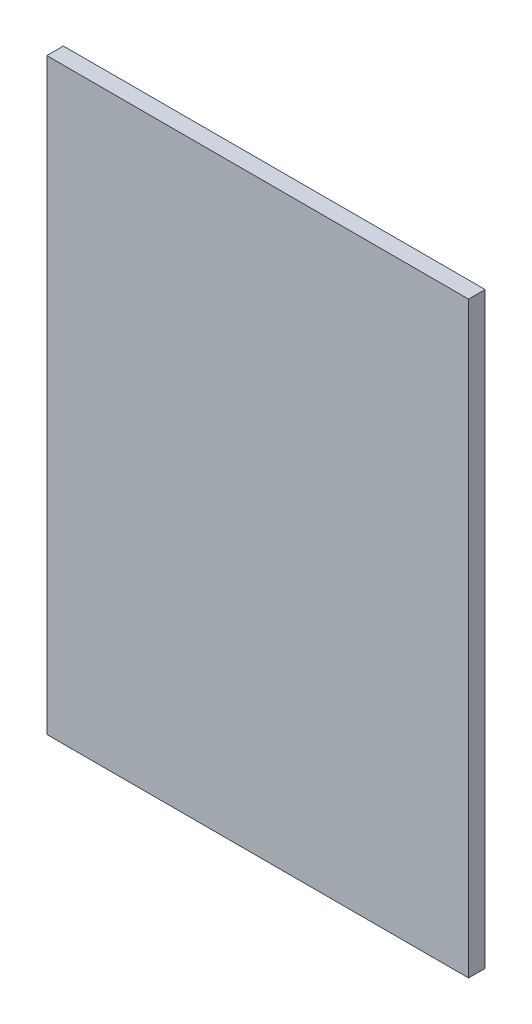
ISO-10303-21;
HEADER;
FILE_DESCRIPTION(('STEP AP214'),'2;1');
FILE_NAME('part.step','',(''),(''),'','','');
FILE_SCHEMA(('AUTOMOTIVE_DESIGN { 1 0 10303 214 1 1 1 1 }'));
ENDSEC;
DATA;
#1=APPLICATION_CONTEXT('core data for automotive mechanical design processes');
#2=APPLICATION_PROTOCOL_DEFINITION('international standard','automotive_design',2000,#1);
#3=PRODUCT_CONTEXT('',#1,'mechanical');
#4=PRODUCT('Part','Part','',(#3));
#5=PRODUCT_RELATED_PRODUCT_CATEGORY('part','',(#4));
#6=PRODUCT_DEFINITION_FORMATION('','',#4);
#7=PRODUCT_DEFINITION_CONTEXT('part definition',#1,'design');
#8=PRODUCT_DEFINITION('design','',#6,#7);
#9=PRODUCT_DEFINITION_SHAPE('','',#8);
#10=(LENGTH_UNIT() NAMED_UNIT(*) SI_UNIT(.MILLI.,.METRE.));
#11=(NAMED_UNIT(*) PLANE_ANGLE_UNIT() SI_UNIT($,.RADIAN.));
#12=(NAMED_UNIT(*) SI_UNIT($,.STERADIAN.) SOLID_ANGLE_UNIT());
#13=UNCERTAINTY_MEASURE_WITH_UNIT(LENGTH_MEASURE(1.E-05),#10,'distance_accuracy_value','');
#14=(GEOMETRIC_REPRESENTATION_CONTEXT(3) GLOBAL_UNCERTAINTY_ASSIGNED_CONTEXT((#13)) GLOBAL_UNIT_ASSIGNED_CONTEXT((#10,
#11,#12)) REPRESENTATION_CONTEXT('',''));
#15=CARTESIAN_POINT('',(0.,0.,0.));
#16=DIRECTION('',(0.,0.,1.));
#17=DIRECTION('',(1.,0.,0.));
#18=AXIS2_PLACEMENT_3D('',#15,#16,#17);
#19=CARTESIAN_POINT('',(40.3225,-56.1975,3.175));
#20=DIRECTION('',(-1.,0.,0.));
#21=DIRECTION('',(0.,0.,1.));
#22=AXIS2_PLACEMENT_3D('',#19,#20,#21);
#23=PLANE('',#22);
#24=DIRECTION('',(0.,1.,0.));
#25=VECTOR('',#24,1.);
#26=CARTESIAN_POINT('',(40.3225,-56.1975,0.));
#27=LINE('',#26,#25);
#28=CARTESIAN_POINT('',(40.3225,-56.1975,0.));
#29=VERTEX_POINT('',#28);
#30=CARTESIAN_POINT('',(40.3225,56.1975,0.));
#31=VERTEX_POINT('',#30);
#32=EDGE_CURVE('E96',#29,#31,#27,.T.);
#33=ORIENTED_EDGE('',*,*,#32,.T.);
#34=DIRECTION('',(0.,0.,-1.));
#35=VECTOR('',#34,1.);
#36=CARTESIAN_POINT('',(40.3225,56.1975,3.175));
#37=LINE('',#36,#35);
#38=CARTESIAN_POINT('',(40.3225,56.1975,3.175));
#39=VERTEX_POINT('',#38);
#40=EDGE_CURVE('E11',#39,#31,#37,.T.);
#41=ORIENTED_EDGE('',*,*,#40,.F.);
#42=DIRECTION('',(0.,1.,0.));
#43=VECTOR('',#42,1.);
#44=CARTESIAN_POINT('',(40.3225,-56.1975,3.175));
#45=LINE('',#44,#43);
#46=CARTESIAN_POINT('',(40.3225,-56.1975,3.175));
#47=VERTEX_POINT('',#46);
#48=EDGE_CURVE('E84',#47,#39,#45,.T.);
#49=ORIENTED_EDGE('',*,*,#48,.F.);
#50=DIRECTION('',(0.,0.,-1.));
#51=VECTOR('',#50,1.);
#52=CARTESIAN_POINT('',(40.3225,-56.1975,3.175));
#53=LINE('',#52,#51);
#54=EDGE_CURVE('E92',#47,#29,#53,.T.);
#55=ORIENTED_EDGE('',*,*,#54,.T.);
#56=EDGE_LOOP('',(#33,#41,#49,#55));
#57=FACE_BOUND('',#56,.T.);
#58=ADVANCED_FACE('F33',(#57),#23,.F.);
#59=CARTESIAN_POINT('',(-40.3225,56.1975,3.175));
#60=DIRECTION('',(0.,-1.,0.));
#61=DIRECTION('',(0.,0.,-1.));
#62=AXIS2_PLACEMENT_3D('',#59,#60,#61);
#63=PLANE('',#62);
#64=DIRECTION('',(-1.,0.,0.));
#65=VECTOR('',#64,1.);
#66=CARTESIAN_POINT('',(-40.3225,56.1975,0.));
#67=LINE('',#66,#65);
#68=CARTESIAN_POINT('',(-40.3225,56.1975,0.));
#69=VERTEX_POINT('',#68);
#70=EDGE_CURVE('E88',#31,#69,#67,.T.);
#71=ORIENTED_EDGE('',*,*,#70,.T.);
#72=DIRECTION('',(0.,0.,-1.));
#73=VECTOR('',#72,1.);
#74=CARTESIAN_POINT('',(-40.3225,56.1975,3.175));
#75=LINE('',#74,#73);
#76=CARTESIAN_POINT('',(-40.3225,56.1975,3.175));
#77=VERTEX_POINT('',#76);
#78=EDGE_CURVE('E41',#77,#69,#75,.T.);
#79=ORIENTED_EDGE('',*,*,#78,.F.);
#80=DIRECTION('',(-1.,0.,0.));
#81=VECTOR('',#80,1.);
#82=CARTESIAN_POINT('',(-40.3225,56.1975,3.175));
#83=LINE('',#82,#81);
#84=EDGE_CURVE('E79',#39,#77,#83,.T.);
#85=ORIENTED_EDGE('',*,*,#84,.F.);
#86=ORIENTED_EDGE('',*,*,#40,.T.);
#87=EDGE_LOOP('',(#71,#79,#85,#86));
#88=FACE_BOUND('',#87,.T.);
#89=ADVANCED_FACE('F87',(#88),#63,.F.);
#90=CARTESIAN_POINT('',(-40.3225,-56.1975,3.175));
#91=DIRECTION('',(1.,0.,0.));
#92=DIRECTION('',(0.,0.,-1.));
#93=AXIS2_PLACEMENT_3D('',#90,#91,#92);
#94=PLANE('',#93);
#95=DIRECTION('',(0.,-1.,0.));
#96=VECTOR('',#95,1.);
#97=CARTESIAN_POINT('',(-40.3225,-56.1975,0.));
#98=LINE('',#97,#96);
#99=CARTESIAN_POINT('',(-40.3225,-56.1975,0.));
#100=VERTEX_POINT('',#99);
#101=EDGE_CURVE('E66',#69,#100,#98,.T.);
#102=ORIENTED_EDGE('',*,*,#101,.T.);
#103=DIRECTION('',(0.,0.,-1.));
#104=VECTOR('',#103,1.);
#105=CARTESIAN_POINT('',(-40.3225,-56.1975,3.175));
#106=LINE('',#105,#104);
#107=CARTESIAN_POINT('',(-40.3225,-56.1975,3.175));
#108=VERTEX_POINT('',#107);
#109=EDGE_CURVE('E89',#108,#100,#106,.T.);
#110=ORIENTED_EDGE('',*,*,#109,.F.);
#111=DIRECTION('',(0.,-1.,0.));
#112=VECTOR('',#111,1.);
#113=CARTESIAN_POINT('',(-40.3225,-56.1975,3.175));
#114=LINE('',#113,#112);
#115=EDGE_CURVE('E82',#77,#108,#114,.T.);
#116=ORIENTED_EDGE('',*,*,#115,.F.);
#117=ORIENTED_EDGE('',*,*,#78,.T.);
#118=EDGE_LOOP('',(#102,#110,#116,#117));
#119=FACE_BOUND('',#118,.T.);
#120=ADVANCED_FACE('F90',(#119),#94,.F.);
#121=CARTESIAN_POINT('',(-40.3225,-56.1975,3.175));
#122=DIRECTION('',(0.,1.,0.));
#123=DIRECTION('',(0.,0.,1.));
#124=AXIS2_PLACEMENT_3D('',#121,#122,#123);
#125=PLANE('',#124);
#126=DIRECTION('',(1.,0.,0.));
#127=VECTOR('',#126,1.);
#128=CARTESIAN_POINT('',(-40.3225,-56.1975,0.));
#129=LINE('',#128,#127);
#130=EDGE_CURVE('E72',#100,#29,#129,.T.);
#131=ORIENTED_EDGE('',*,*,#130,.T.);
#132=ORIENTED_EDGE('',*,*,#54,.F.);
#133=DIRECTION('',(1.,0.,0.));
#134=VECTOR('',#133,1.);
#135=CARTESIAN_POINT('',(-40.3225,-56.1975,3.175));
#136=LINE('',#135,#134);
#137=EDGE_CURVE('E49',#108,#47,#136,.T.);
#138=ORIENTED_EDGE('',*,*,#137,.F.);
#139=ORIENTED_EDGE('',*,*,#109,.T.);
#140=EDGE_LOOP('',(#131,#132,#138,#139));
#141=FACE_BOUND('',#140,.T.);
#142=ADVANCED_FACE('F103',(#141),#125,.F.);
#143=CARTESIAN_POINT('',(40.3225,56.1975,3.175));
#144=DIRECTION('',(0.,0.,-1.));
#145=DIRECTION('',(-1.,0.,0.));
#146=AXIS2_PLACEMENT_3D('',#143,#144,#145);
#147=PLANE('',#146);
#148=ORIENTED_EDGE('',*,*,#48,.T.);
#149=ORIENTED_EDGE('',*,*,#84,.T.);
#150=ORIENTED_EDGE('',*,*,#115,.T.);
#151=ORIENTED_EDGE('',*,*,#137,.T.);
#152=EDGE_LOOP('',(#148,#149,#150,#151));
#153=FACE_BOUND('',#152,.T.);
#154=ADVANCED_FACE('F80',(#153),#147,.F.);
#155=CARTESIAN_POINT('',(40.3225,56.1975,0.));
#156=DIRECTION('',(0.,0.,-1.));
#157=DIRECTION('',(-1.,0.,0.));
#158=AXIS2_PLACEMENT_3D('',#155,#156,#157);
#159=PLANE('',#158);
#160=ORIENTED_EDGE('',*,*,#32,.F.);
#161=ORIENTED_EDGE('',*,*,#130,.F.);
#162=ORIENTED_EDGE('',*,*,#101,.F.);
#163=ORIENTED_EDGE('',*,*,#70,.F.);
#164=EDGE_LOOP('',(#160,#161,#162,#163));
#165=FACE_BOUND('',#164,.T.);
#166=ADVANCED_FACE('F106',(#165),#159,.T.);
#167=CLOSED_SHELL('',(#58,#89,#120,#142,#154,#166));
#168=MANIFOLD_SOLID_BREP('B2',#167);
#169=ADVANCED_BREP_SHAPE_REPRESENTATION('',(#18,#168),#14);
#170=SHAPE_DEFINITION_REPRESENTATION(#9,#169);
ENDSEC;
END-ISO-10303-21;
